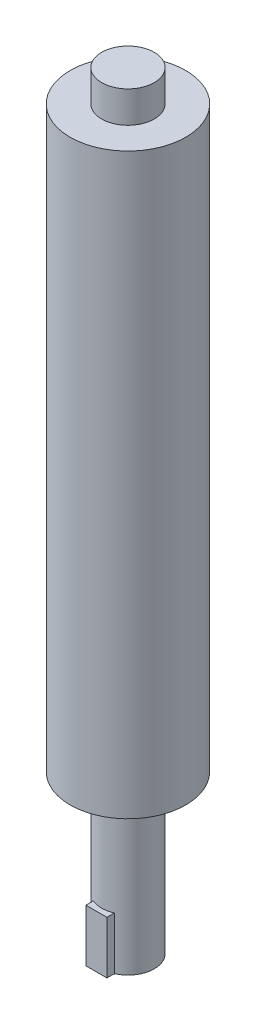
ISO-10303-21;
HEADER;
FILE_DESCRIPTION(('STEP AP214'),'2;1');
FILE_NAME('part.step','',(''),(''),'','','');
FILE_SCHEMA(('AUTOMOTIVE_DESIGN { 1 0 10303 214 1 1 1 1 }'));
ENDSEC;
DATA;
#1=APPLICATION_CONTEXT('core data for automotive mechanical design processes');
#2=APPLICATION_PROTOCOL_DEFINITION('international standard','automotive_design',2000,#1);
#3=PRODUCT_CONTEXT('',#1,'mechanical');
#4=PRODUCT('Part','Part','',(#3));
#5=PRODUCT_RELATED_PRODUCT_CATEGORY('part','',(#4));
#6=PRODUCT_DEFINITION_FORMATION('','',#4);
#7=PRODUCT_DEFINITION_CONTEXT('part definition',#1,'design');
#8=PRODUCT_DEFINITION('design','',#6,#7);
#9=PRODUCT_DEFINITION_SHAPE('','',#8);
#10=(LENGTH_UNIT() NAMED_UNIT(*) SI_UNIT(.MILLI.,.METRE.));
#11=(NAMED_UNIT(*) PLANE_ANGLE_UNIT() SI_UNIT($,.RADIAN.));
#12=(NAMED_UNIT(*) SI_UNIT($,.STERADIAN.) SOLID_ANGLE_UNIT());
#13=UNCERTAINTY_MEASURE_WITH_UNIT(LENGTH_MEASURE(1.E-05),#10,'distance_accuracy_value','');
#14=(GEOMETRIC_REPRESENTATION_CONTEXT(3) GLOBAL_UNCERTAINTY_ASSIGNED_CONTEXT((#13)) GLOBAL_UNIT_ASSIGNED_CONTEXT((#10,
#11,#12)) REPRESENTATION_CONTEXT('',''));
#15=CARTESIAN_POINT('',(0.,0.,0.));
#16=DIRECTION('',(0.,0.,1.));
#17=DIRECTION('',(1.,0.,0.));
#18=AXIS2_PLACEMENT_3D('',#15,#16,#17);
#19=CARTESIAN_POINT('',(0.,30.5,0.));
#20=DIRECTION('',(0.,-1.,0.));
#21=DIRECTION('',(0.,0.,-1.));
#22=AXIS2_PLACEMENT_3D('',#19,#20,#21);
#23=CYLINDRICAL_SURFACE('',#22,2.5);
#24=CARTESIAN_POINT('',(0.,27.5,0.));
#25=DIRECTION('',(0.,1.,0.));
#26=DIRECTION('',(0.,0.,1.));
#27=AXIS2_PLACEMENT_3D('',#24,#25,#26);
#28=CIRCLE('',#27,2.5);
#29=CARTESIAN_POINT('',(0.,27.5,-2.5));
#30=VERTEX_POINT('',#29);
#31=EDGE_CURVE('E130',#30,#30,#28,.T.);
#32=CARTESIAN_POINT('',(0.,30.5,0.));
#33=DIRECTION('',(0.,1.,0.));
#34=DIRECTION('',(0.,0.,1.));
#35=AXIS2_PLACEMENT_3D('',#32,#33,#34);
#36=CIRCLE('',#35,2.5);
#37=CARTESIAN_POINT('',(0.,30.5,-2.5));
#38=VERTEX_POINT('',#37);
#39=EDGE_CURVE('E133',#38,#38,#36,.T.);
#40=CARTESIAN_POINT('',(0.,27.5,-2.5));
#41=CARTESIAN_POINT('',(0.,27.53125,-2.5));
#42=CARTESIAN_POINT('',(0.,27.5625,-2.5));
#43=CARTESIAN_POINT('',(0.,27.625,-2.5));
#44=CARTESIAN_POINT('',(0.,27.65625,-2.5));
#45=CARTESIAN_POINT('',(0.,27.71875,-2.5));
#46=CARTESIAN_POINT('',(0.,27.75,-2.5));
#47=CARTESIAN_POINT('',(0.,27.8125,-2.5));
#48=CARTESIAN_POINT('',(0.,27.84375,-2.5));
#49=CARTESIAN_POINT('',(0.,27.90625,-2.5));
#50=CARTESIAN_POINT('',(0.,27.9375,-2.5));
#51=CARTESIAN_POINT('',(0.,28.,-2.5));
#52=CARTESIAN_POINT('',(0.,28.03125,-2.5));
#53=CARTESIAN_POINT('',(0.,28.09375,-2.5));
#54=CARTESIAN_POINT('',(0.,28.125,-2.5));
#55=CARTESIAN_POINT('',(0.,28.1875,-2.5));
#56=CARTESIAN_POINT('',(0.,28.21875,-2.5));
#57=CARTESIAN_POINT('',(0.,28.28125,-2.5));
#58=CARTESIAN_POINT('',(0.,28.3125,-2.5));
#59=CARTESIAN_POINT('',(0.,28.375,-2.5));
#60=CARTESIAN_POINT('',(0.,28.40625,-2.5));
#61=CARTESIAN_POINT('',(0.,28.46875,-2.5));
#62=CARTESIAN_POINT('',(0.,28.5,-2.5));
#63=CARTESIAN_POINT('',(0.,28.5625,-2.5));
#64=CARTESIAN_POINT('',(0.,28.59375,-2.5));
#65=CARTESIAN_POINT('',(0.,28.65625,-2.5));
#66=CARTESIAN_POINT('',(0.,28.6875,-2.5));
#67=CARTESIAN_POINT('',(0.,28.75,-2.5));
#68=CARTESIAN_POINT('',(0.,28.78125,-2.5));
#69=CARTESIAN_POINT('',(0.,28.84375,-2.5));
#70=CARTESIAN_POINT('',(0.,28.875,-2.5));
#71=CARTESIAN_POINT('',(0.,28.9375,-2.5));
#72=CARTESIAN_POINT('',(0.,28.96875,-2.5));
#73=CARTESIAN_POINT('',(0.,29.03125,-2.5));
#74=CARTESIAN_POINT('',(0.,29.0625,-2.5));
#75=CARTESIAN_POINT('',(0.,29.125,-2.5));
#76=CARTESIAN_POINT('',(0.,29.15625,-2.5));
#77=CARTESIAN_POINT('',(0.,29.21875,-2.5));
#78=CARTESIAN_POINT('',(0.,29.25,-2.5));
#79=CARTESIAN_POINT('',(0.,29.3125,-2.5));
#80=CARTESIAN_POINT('',(0.,29.34375,-2.5));
#81=CARTESIAN_POINT('',(0.,29.40625,-2.5));
#82=CARTESIAN_POINT('',(0.,29.4375,-2.5));
#83=CARTESIAN_POINT('',(0.,29.5,-2.5));
#84=CARTESIAN_POINT('',(0.,29.53125,-2.5));
#85=CARTESIAN_POINT('',(0.,29.59375,-2.5));
#86=CARTESIAN_POINT('',(0.,29.625,-2.5));
#87=CARTESIAN_POINT('',(0.,29.6875,-2.5));
#88=CARTESIAN_POINT('',(0.,29.71875,-2.5));
#89=CARTESIAN_POINT('',(0.,29.78125,-2.5));
#90=CARTESIAN_POINT('',(0.,29.8125,-2.5));
#91=CARTESIAN_POINT('',(0.,29.875,-2.5));
#92=CARTESIAN_POINT('',(0.,29.90625,-2.5));
#93=CARTESIAN_POINT('',(0.,29.96875,-2.5));
#94=CARTESIAN_POINT('',(0.,30.,-2.5));
#95=CARTESIAN_POINT('',(0.,30.0625,-2.5));
#96=CARTESIAN_POINT('',(0.,30.09375,-2.5));
#97=CARTESIAN_POINT('',(0.,30.15625,-2.5));
#98=CARTESIAN_POINT('',(0.,30.1875,-2.5));
#99=CARTESIAN_POINT('',(0.,30.25,-2.5));
#100=CARTESIAN_POINT('',(0.,30.28125,-2.5));
#101=CARTESIAN_POINT('',(0.,30.34375,-2.5));
#102=CARTESIAN_POINT('',(0.,30.375,-2.5));
#103=CARTESIAN_POINT('',(0.,30.4375,-2.5));
#104=CARTESIAN_POINT('',(0.,30.46875,-2.5));
#105=CARTESIAN_POINT('',(0.,30.5,-2.5));
#106=B_SPLINE_CURVE_WITH_KNOTS('',3,(#40,#41,#42,#43,#44,#45,#46,#47,#48,#49,#50,#51,#52,#53,
#54,#55,#56,#57,#58,#59,#60,#61,#62,#63,#64,#65,#66,#67,#68,#69,#70,#71,#72,#73,#74,#75,#76,#77,
#78,#79,#80,#81,#82,#83,#84,#85,#86,#87,#88,#89,#90,#91,#92,#93,#94,#95,#96,#97,#98,#99,#100,
#101,#102,#103,#104,#105),.UNSPECIFIED.,.F.,.F.,(4,2,2,2,2,2,2,2,2,2,2,2,2,2,2,2,2,2,2,2,2,2,2,
2,2,2,2,2,2,2,2,2,4),(0.,0.0937500000000001,0.1875,0.28125,0.374999999999997,0.46875,
0.562499999999997,0.656249999999997,0.749999999999997,0.843749999999997,0.937499999999997,
1.03125,1.125,1.21875,1.3125,1.40625,1.5,1.59375,1.6875,1.78125,1.875,1.96875,2.0625,2.15625,
2.25,2.34375,2.4375,2.53125,2.625,2.71875,2.8125,2.90625,3.),.UNSPECIFIED.);
#107=EDGE_CURVE('BSEAM45',#30,#38,#106,.T.);
#108=ORIENTED_EDGE('',*,*,#31,.T.);
#109=ORIENTED_EDGE('',*,*,#39,.F.);
#110=ORIENTED_EDGE('',*,*,#107,.T.);
#111=ORIENTED_EDGE('',*,*,#107,.F.);
#112=EDGE_LOOP('',(#108,#110,#109,#111));
#113=FACE_BOUND('',#112,.T.);
#114=ADVANCED_FACE('F45',(#113),#23,.T.);
#115=CARTESIAN_POINT('',(0.,30.5,0.));
#116=DIRECTION('',(0.,1.,0.));
#117=DIRECTION('',(0.,0.,1.));
#118=AXIS2_PLACEMENT_3D('',#115,#116,#117);
#119=PLANE('',#118);
#120=ORIENTED_EDGE('',*,*,#39,.T.);
#121=EDGE_LOOP('',(#120));
#122=FACE_BOUND('',#121,.T.);
#123=ADVANCED_FACE('F152',(#122),#119,.T.);
#124=CARTESIAN_POINT('',(0.,27.5,0.));
#125=DIRECTION('',(0.,-1.,0.));
#126=DIRECTION('',(0.,0.,-1.));
#127=AXIS2_PLACEMENT_3D('',#124,#125,#126);
#128=CYLINDRICAL_SURFACE('',#127,5.5);
#129=CARTESIAN_POINT('',(0.,27.5,0.));
#130=DIRECTION('',(0.,1.,0.));
#131=DIRECTION('',(0.,0.,1.));
#132=AXIS2_PLACEMENT_3D('',#129,#130,#131);
#133=CIRCLE('',#132,5.5);
#134=CARTESIAN_POINT('',(0.,27.5,5.5));
#135=VERTEX_POINT('',#134);
#136=EDGE_CURVE('E127',#135,#135,#133,.T.);
#137=ORIENTED_EDGE('',*,*,#136,.F.);
#138=EDGE_LOOP('',(#137));
#139=FACE_BOUND('',#138,.T.);
#140=CARTESIAN_POINT('',(0.,-27.5,0.));
#141=DIRECTION('',(0.,1.,0.));
#142=DIRECTION('',(0.,0.,1.));
#143=AXIS2_PLACEMENT_3D('',#140,#141,#142);
#144=CIRCLE('',#143,5.5);
#145=CARTESIAN_POINT('',(0.,-27.5,5.5));
#146=VERTEX_POINT('',#145);
#147=EDGE_CURVE('E126',#146,#146,#144,.T.);
#148=ORIENTED_EDGE('',*,*,#147,.T.);
#149=EDGE_LOOP('',(#148));
#150=FACE_BOUND('',#149,.T.);
#151=ADVANCED_FACE('F146',(#139,#150),#128,.T.);
#152=CARTESIAN_POINT('',(0.,27.5,0.));
#153=DIRECTION('',(0.,1.,0.));
#154=DIRECTION('',(0.,0.,1.));
#155=AXIS2_PLACEMENT_3D('',#152,#153,#154);
#156=PLANE('',#155);
#157=ORIENTED_EDGE('',*,*,#31,.F.);
#158=EDGE_LOOP('',(#157));
#159=FACE_BOUND('',#158,.T.);
#160=ORIENTED_EDGE('',*,*,#136,.T.);
#161=EDGE_LOOP('',(#160));
#162=FACE_BOUND('',#161,.T.);
#163=ADVANCED_FACE('F142',(#159,#162),#156,.T.);
#164=CARTESIAN_POINT('',(0.,-27.5,0.));
#165=DIRECTION('',(0.,1.,0.));
#166=DIRECTION('',(0.,0.,1.));
#167=AXIS2_PLACEMENT_3D('',#164,#165,#166);
#168=PLANE('',#167);
#169=CARTESIAN_POINT('',(0.,-27.5,0.));
#170=DIRECTION('',(0.,1.,0.));
#171=DIRECTION('',(0.,0.,1.));
#172=AXIS2_PLACEMENT_3D('',#169,#170,#171);
#173=CIRCLE('',#172,2.5);
#174=CARTESIAN_POINT('',(0.,-27.5,2.5));
#175=VERTEX_POINT('',#174);
#176=EDGE_CURVE('E52',#175,#175,#173,.T.);
#177=ORIENTED_EDGE('',*,*,#176,.T.);
#178=EDGE_LOOP('',(#177));
#179=FACE_BOUND('',#178,.T.);
#180=ORIENTED_EDGE('',*,*,#147,.F.);
#181=EDGE_LOOP('',(#180));
#182=FACE_BOUND('',#181,.T.);
#183=ADVANCED_FACE('F145',(#179,#182),#168,.F.);
#184=ORIENTED_EDGE('',*,*,#176,.F.);
#185=EDGE_LOOP('',(#184));
#186=FACE_BOUND('',#185,.T.);
#187=CARTESIAN_POINT('',(0.,-37.5,0.));
#188=DIRECTION('',(0.,-1.,0.));
#189=DIRECTION('',(0.,0.,-1.));
#190=AXIS2_PLACEMENT_3D('',#187,#188,#189);
#191=CIRCLE('',#190,2.5);
#192=CARTESIAN_POINT('',(1.,-37.5,2.29128784747792));
#193=VERTEX_POINT('',#192);
#194=CARTESIAN_POINT('',(-0.999999999999999,-37.5,2.29128784747792));
#195=VERTEX_POINT('',#194);
#196=EDGE_CURVE('E11',#193,#195,#191,.T.);
#197=ORIENTED_EDGE('',*,*,#196,.F.);
#198=DIRECTION('',(0.,-1.,0.));
#199=VECTOR('',#198,1.);
#200=CARTESIAN_POINT('',(1.,30.5,2.29128784747792));
#201=LINE('',#200,#199);
#202=CARTESIAN_POINT('',(1.,-42.5,2.29128784747792));
#203=VERTEX_POINT('',#202);
#204=EDGE_CURVE('E67',#193,#203,#201,.T.);
#205=ORIENTED_EDGE('',*,*,#204,.T.);
#206=CARTESIAN_POINT('',(0.,-42.5,0.));
#207=DIRECTION('',(0.,-1.,0.));
#208=DIRECTION('',(0.,0.,-1.));
#209=AXIS2_PLACEMENT_3D('',#206,#207,#208);
#210=CIRCLE('',#209,2.5);
#211=CARTESIAN_POINT('',(-0.999999999999999,-42.5,2.29128784747792));
#212=VERTEX_POINT('',#211);
#213=EDGE_CURVE('E124',#212,#203,#210,.T.);
#214=ORIENTED_EDGE('',*,*,#213,.F.);
#215=DIRECTION('',(0.,-1.,0.));
#216=VECTOR('',#215,1.);
#217=CARTESIAN_POINT('',(-0.999999999999999,30.5,2.29128784747792));
#218=LINE('',#217,#216);
#219=EDGE_CURVE('E118',#212,#195,#218,.F.);
#220=ORIENTED_EDGE('',*,*,#219,.T.);
#221=EDGE_LOOP('',(#197,#205,#214,#220));
#222=FACE_BOUND('',#221,.T.);
#223=ADVANCED_FACE('F157',(#186,#222),#23,.T.);
#224=CARTESIAN_POINT('',(0.,-42.5,0.));
#225=DIRECTION('',(0.,-1.,0.));
#226=DIRECTION('',(0.,0.,-1.));
#227=AXIS2_PLACEMENT_3D('',#224,#225,#226);
#228=PLANE('',#227);
#229=CARTESIAN_POINT('',(0.,-42.5,0.));
#230=DIRECTION('',(0.,-1.,0.));
#231=DIRECTION('',(0.,0.,-1.));
#232=AXIS2_PLACEMENT_3D('',#229,#230,#231);
#233=CIRCLE('',#232,1.65);
#234=CARTESIAN_POINT('',(0.,-42.5,-1.65));
#235=VERTEX_POINT('',#234);
#236=EDGE_CURVE('E98',#235,#235,#233,.T.);
#237=ORIENTED_EDGE('',*,*,#236,.F.);
#238=EDGE_LOOP('',(#237));
#239=FACE_BOUND('',#238,.T.);
#240=ORIENTED_EDGE('',*,*,#213,.T.);
#241=DIRECTION('',(0.,0.,1.));
#242=VECTOR('',#241,1.);
#243=CARTESIAN_POINT('',(1.,-42.5,3.));
#244=LINE('',#243,#242);
#245=CARTESIAN_POINT('',(1.,-42.5,3.));
#246=VERTEX_POINT('',#245);
#247=EDGE_CURVE('E97',#203,#246,#244,.T.);
#248=ORIENTED_EDGE('',*,*,#247,.T.);
#249=DIRECTION('',(-1.,0.,0.));
#250=VECTOR('',#249,1.);
#251=CARTESIAN_POINT('',(-1.,-42.5,3.));
#252=LINE('',#251,#250);
#253=CARTESIAN_POINT('',(-1.,-42.5,3.));
#254=VERTEX_POINT('',#253);
#255=EDGE_CURVE('E100',#246,#254,#252,.T.);
#256=ORIENTED_EDGE('',*,*,#255,.T.);
#257=DIRECTION('',(0.,0.,-1.));
#258=VECTOR('',#257,1.);
#259=CARTESIAN_POINT('',(-1.,-42.5,3.));
#260=LINE('',#259,#258);
#261=EDGE_CURVE('E59',#254,#212,#260,.T.);
#262=ORIENTED_EDGE('',*,*,#261,.T.);
#263=EDGE_LOOP('',(#240,#248,#256,#262));
#264=FACE_BOUND('',#263,.T.);
#265=ADVANCED_FACE('F163',(#239,#264),#228,.T.);
#266=CARTESIAN_POINT('',(1.,-37.5,3.));
#267=DIRECTION('',(1.,0.,0.));
#268=DIRECTION('',(0.,0.,-1.));
#269=AXIS2_PLACEMENT_3D('',#266,#267,#268);
#270=PLANE('',#269);
#271=ORIENTED_EDGE('',*,*,#204,.F.);
#272=DIRECTION('',(0.,0.,1.));
#273=VECTOR('',#272,1.);
#274=CARTESIAN_POINT('',(1.,-37.5,3.));
#275=LINE('',#274,#273);
#276=CARTESIAN_POINT('',(1.,-37.5,3.));
#277=VERTEX_POINT('',#276);
#278=EDGE_CURVE('E105',#193,#277,#275,.T.);
#279=ORIENTED_EDGE('',*,*,#278,.T.);
#280=DIRECTION('',(0.,-1.,0.));
#281=VECTOR('',#280,1.);
#282=CARTESIAN_POINT('',(1.,-37.5,3.));
#283=LINE('',#282,#281);
#284=EDGE_CURVE('E112',#277,#246,#283,.T.);
#285=ORIENTED_EDGE('',*,*,#284,.T.);
#286=ORIENTED_EDGE('',*,*,#247,.F.);
#287=EDGE_LOOP('',(#271,#279,#285,#286));
#288=FACE_BOUND('',#287,.T.);
#289=ADVANCED_FACE('F212',(#288),#270,.T.);
#290=CARTESIAN_POINT('',(-1.,-37.5,3.));
#291=DIRECTION('',(-1.,0.,0.));
#292=DIRECTION('',(0.,0.,1.));
#293=AXIS2_PLACEMENT_3D('',#290,#291,#292);
#294=PLANE('',#293);
#295=ORIENTED_EDGE('',*,*,#219,.F.);
#296=ORIENTED_EDGE('',*,*,#261,.F.);
#297=DIRECTION('',(0.,-1.,0.));
#298=VECTOR('',#297,1.);
#299=CARTESIAN_POINT('',(-1.,-37.5,3.));
#300=LINE('',#299,#298);
#301=CARTESIAN_POINT('',(-1.,-37.5,3.));
#302=VERTEX_POINT('',#301);
#303=EDGE_CURVE('E116',#302,#254,#300,.T.);
#304=ORIENTED_EDGE('',*,*,#303,.F.);
#305=DIRECTION('',(0.,0.,-1.));
#306=VECTOR('',#305,1.);
#307=CARTESIAN_POINT('',(-1.,-37.5,3.));
#308=LINE('',#307,#306);
#309=EDGE_CURVE('E110',#302,#195,#308,.T.);
#310=ORIENTED_EDGE('',*,*,#309,.T.);
#311=EDGE_LOOP('',(#295,#296,#304,#310));
#312=FACE_BOUND('',#311,.T.);
#313=ADVANCED_FACE('F225',(#312),#294,.T.);
#314=CARTESIAN_POINT('',(-1.,-37.5,3.));
#315=DIRECTION('',(0.,0.,1.));
#316=DIRECTION('',(1.,0.,0.));
#317=AXIS2_PLACEMENT_3D('',#314,#315,#316);
#318=PLANE('',#317);
#319=ORIENTED_EDGE('',*,*,#255,.F.);
#320=ORIENTED_EDGE('',*,*,#284,.F.);
#321=DIRECTION('',(-1.,0.,0.));
#322=VECTOR('',#321,1.);
#323=CARTESIAN_POINT('',(-1.,-37.5,3.));
#324=LINE('',#323,#322);
#325=EDGE_CURVE('E107',#277,#302,#324,.T.);
#326=ORIENTED_EDGE('',*,*,#325,.T.);
#327=ORIENTED_EDGE('',*,*,#303,.T.);
#328=EDGE_LOOP('',(#319,#320,#326,#327));
#329=FACE_BOUND('',#328,.T.);
#330=ADVANCED_FACE('F234',(#329),#318,.T.);
#331=CARTESIAN_POINT('',(0.,-37.5,0.));
#332=DIRECTION('',(0.,-1.,0.));
#333=DIRECTION('',(0.,0.,-1.));
#334=AXIS2_PLACEMENT_3D('',#331,#332,#333);
#335=PLANE('',#334);
#336=ORIENTED_EDGE('',*,*,#278,.F.);
#337=ORIENTED_EDGE('',*,*,#196,.T.);
#338=ORIENTED_EDGE('',*,*,#309,.F.);
#339=ORIENTED_EDGE('',*,*,#325,.F.);
#340=EDGE_LOOP('',(#336,#337,#338,#339));
#341=FACE_BOUND('',#340,.T.);
#342=ADVANCED_FACE('F91',(#341),#335,.F.);
#343=CARTESIAN_POINT('',(0.,-31.9914200213955,0.));
#344=DIRECTION('',(0.,-1.,0.));
#345=DIRECTION('',(0.,0.,-1.));
#346=AXIS2_PLACEMENT_3D('',#343,#344,#345);
#347=CONICAL_SURFACE('',#346,1.65,1.02974425867665);
#348=CARTESIAN_POINT('',(0.,-31.,0.));
#349=VERTEX_POINT('',#348);
#350=VERTEX_LOOP('',#349);
#351=FACE_BOUND('',#350,.T.);
#352=CARTESIAN_POINT('',(0.,-31.9914200213955,0.));
#353=DIRECTION('',(0.,-1.,0.));
#354=DIRECTION('',(0.,0.,-1.));
#355=AXIS2_PLACEMENT_3D('',#352,#353,#354);
#356=CIRCLE('',#355,1.65);
#357=CARTESIAN_POINT('',(0.,-31.9914200213955,-1.65));
#358=VERTEX_POINT('',#357);
#359=EDGE_CURVE('E95',#358,#358,#356,.T.);
#360=ORIENTED_EDGE('',*,*,#359,.T.);
#361=EDGE_LOOP('',(#360));
#362=FACE_BOUND('',#361,.T.);
#363=ADVANCED_FACE('F87',(#351,#362),#347,.F.);
#364=CARTESIAN_POINT('',(0.,-42.5,0.));
#365=DIRECTION('',(0.,-1.,0.));
#366=DIRECTION('',(0.,0.,-1.));
#367=AXIS2_PLACEMENT_3D('',#364,#365,#366);
#368=CYLINDRICAL_SURFACE('',#367,1.65);
#369=ORIENTED_EDGE('',*,*,#359,.F.);
#370=EDGE_LOOP('',(#369));
#371=FACE_BOUND('',#370,.T.);
#372=ORIENTED_EDGE('',*,*,#236,.T.);
#373=EDGE_LOOP('',(#372));
#374=FACE_BOUND('',#373,.T.);
#375=ADVANCED_FACE('F90',(#371,#374),#368,.F.);
#376=CLOSED_SHELL('',(#114,#123,#151,#163,#183,#223,#265,#289,#313,#330,#342,#363,#375));
#377=MANIFOLD_SOLID_BREP('B2',#376);
#378=ADVANCED_BREP_SHAPE_REPRESENTATION('',(#18,#377),#14);
#379=SHAPE_DEFINITION_REPRESENTATION(#9,#378);
ENDSEC;
END-ISO-10303-21;
